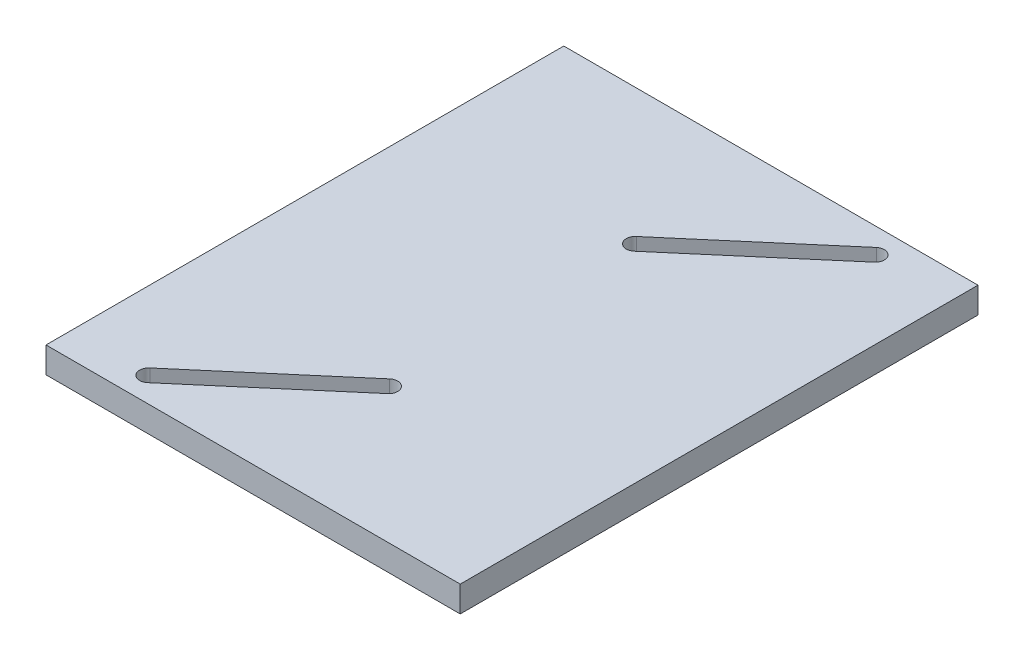
ISO-10303-21;
HEADER;
FILE_DESCRIPTION(('STEP AP214'),'2;1');
FILE_NAME('part.step','',(''),(''),'','','');
FILE_SCHEMA(('AUTOMOTIVE_DESIGN { 1 0 10303 214 1 1 1 1 }'));
ENDSEC;
DATA;
#1=APPLICATION_CONTEXT('core data for automotive mechanical design processes');
#2=APPLICATION_PROTOCOL_DEFINITION('international standard','automotive_design',2000,#1);
#3=PRODUCT_CONTEXT('',#1,'mechanical');
#4=PRODUCT('Part','Part','',(#3));
#5=PRODUCT_RELATED_PRODUCT_CATEGORY('part','',(#4));
#6=PRODUCT_DEFINITION_FORMATION('','',#4);
#7=PRODUCT_DEFINITION_CONTEXT('part definition',#1,'design');
#8=PRODUCT_DEFINITION('design','',#6,#7);
#9=PRODUCT_DEFINITION_SHAPE('','',#8);
#10=(LENGTH_UNIT() NAMED_UNIT(*) SI_UNIT(.MILLI.,.METRE.));
#11=(NAMED_UNIT(*) PLANE_ANGLE_UNIT() SI_UNIT($,.RADIAN.));
#12=(NAMED_UNIT(*) SI_UNIT($,.STERADIAN.) SOLID_ANGLE_UNIT());
#13=UNCERTAINTY_MEASURE_WITH_UNIT(LENGTH_MEASURE(1.E-05),#10,'distance_accuracy_value','');
#14=(GEOMETRIC_REPRESENTATION_CONTEXT(3) GLOBAL_UNCERTAINTY_ASSIGNED_CONTEXT((#13)) GLOBAL_UNIT_ASSIGNED_CONTEXT((#10,
#11,#12)) REPRESENTATION_CONTEXT('',''));
#15=CARTESIAN_POINT('',(0.,0.,0.));
#16=DIRECTION('',(0.,0.,1.));
#17=DIRECTION('',(1.,0.,0.));
#18=AXIS2_PLACEMENT_3D('',#15,#16,#17);
#19=CARTESIAN_POINT('',(50.8,6.35,63.5));
#20=DIRECTION('',(-1.,0.,0.));
#21=DIRECTION('',(0.,0.,1.));
#22=AXIS2_PLACEMENT_3D('',#19,#20,#21);
#23=PLANE('',#22);
#24=DIRECTION('',(0.,0.,-1.));
#25=VECTOR('',#24,1.);
#26=CARTESIAN_POINT('',(50.8,0.,63.5));
#27=LINE('',#26,#25);
#28=CARTESIAN_POINT('',(50.8,0.,63.5));
#29=VERTEX_POINT('',#28);
#30=CARTESIAN_POINT('',(50.8,0.,-63.5));
#31=VERTEX_POINT('',#30);
#32=EDGE_CURVE('E175',#29,#31,#27,.T.);
#33=ORIENTED_EDGE('',*,*,#32,.T.);
#34=DIRECTION('',(0.,-1.,0.));
#35=VECTOR('',#34,1.);
#36=CARTESIAN_POINT('',(50.8,6.35,-63.5));
#37=LINE('',#36,#35);
#38=CARTESIAN_POINT('',(50.8,6.35,-63.5));
#39=VERTEX_POINT('',#38);
#40=EDGE_CURVE('E11',#39,#31,#37,.T.);
#41=ORIENTED_EDGE('',*,*,#40,.F.);
#42=DIRECTION('',(0.,0.,-1.));
#43=VECTOR('',#42,1.);
#44=CARTESIAN_POINT('',(50.8,6.35,63.5));
#45=LINE('',#44,#43);
#46=CARTESIAN_POINT('',(50.8,6.35,63.5));
#47=VERTEX_POINT('',#46);
#48=EDGE_CURVE('E222',#47,#39,#45,.T.);
#49=ORIENTED_EDGE('',*,*,#48,.F.);
#50=DIRECTION('',(0.,-1.,0.));
#51=VECTOR('',#50,1.);
#52=CARTESIAN_POINT('',(50.8,6.35,63.5));
#53=LINE('',#52,#51);
#54=EDGE_CURVE('E236',#47,#29,#53,.T.);
#55=ORIENTED_EDGE('',*,*,#54,.T.);
#56=EDGE_LOOP('',(#33,#41,#49,#55));
#57=FACE_BOUND('',#56,.T.);
#58=ADVANCED_FACE('F39',(#57),#23,.F.);
#59=CARTESIAN_POINT('',(-50.8,6.35,-63.5));
#60=DIRECTION('',(0.,0.,1.));
#61=DIRECTION('',(1.,0.,0.));
#62=AXIS2_PLACEMENT_3D('',#59,#60,#61);
#63=PLANE('',#62);
#64=DIRECTION('',(-1.,0.,0.));
#65=VECTOR('',#64,1.);
#66=CARTESIAN_POINT('',(-50.8,0.,-63.5));
#67=LINE('',#66,#65);
#68=CARTESIAN_POINT('',(-50.8,0.,-63.5));
#69=VERTEX_POINT('',#68);
#70=EDGE_CURVE('E240',#31,#69,#67,.T.);
#71=ORIENTED_EDGE('',*,*,#70,.T.);
#72=DIRECTION('',(0.,-1.,0.));
#73=VECTOR('',#72,1.);
#74=CARTESIAN_POINT('',(-50.8,6.35,-63.5));
#75=LINE('',#74,#73);
#76=CARTESIAN_POINT('',(-50.8,6.35,-63.5));
#77=VERTEX_POINT('',#76);
#78=EDGE_CURVE('E47',#77,#69,#75,.T.);
#79=ORIENTED_EDGE('',*,*,#78,.F.);
#80=DIRECTION('',(-1.,0.,0.));
#81=VECTOR('',#80,1.);
#82=CARTESIAN_POINT('',(-50.8,6.35,-63.5));
#83=LINE('',#82,#81);
#84=EDGE_CURVE('E226',#39,#77,#83,.T.);
#85=ORIENTED_EDGE('',*,*,#84,.F.);
#86=ORIENTED_EDGE('',*,*,#40,.T.);
#87=EDGE_LOOP('',(#71,#79,#85,#86));
#88=FACE_BOUND('',#87,.T.);
#89=ADVANCED_FACE('F275',(#88),#63,.F.);
#90=CARTESIAN_POINT('',(-50.8,6.35,63.5));
#91=DIRECTION('',(1.,0.,0.));
#92=DIRECTION('',(0.,0.,-1.));
#93=AXIS2_PLACEMENT_3D('',#90,#91,#92);
#94=PLANE('',#93);
#95=DIRECTION('',(0.,0.,1.));
#96=VECTOR('',#95,1.);
#97=CARTESIAN_POINT('',(-50.8,0.,63.5));
#98=LINE('',#97,#96);
#99=CARTESIAN_POINT('',(-50.8,0.,63.5));
#100=VERTEX_POINT('',#99);
#101=EDGE_CURVE('E243',#69,#100,#98,.T.);
#102=ORIENTED_EDGE('',*,*,#101,.T.);
#103=DIRECTION('',(0.,-1.,0.));
#104=VECTOR('',#103,1.);
#105=CARTESIAN_POINT('',(-50.8,6.35,63.5));
#106=LINE('',#105,#104);
#107=CARTESIAN_POINT('',(-50.8,6.35,63.5));
#108=VERTEX_POINT('',#107);
#109=EDGE_CURVE('E251',#108,#100,#106,.T.);
#110=ORIENTED_EDGE('',*,*,#109,.F.);
#111=DIRECTION('',(0.,0.,1.));
#112=VECTOR('',#111,1.);
#113=CARTESIAN_POINT('',(-50.8,6.35,63.5));
#114=LINE('',#113,#112);
#115=EDGE_CURVE('E230',#77,#108,#114,.T.);
#116=ORIENTED_EDGE('',*,*,#115,.F.);
#117=ORIENTED_EDGE('',*,*,#78,.T.);
#118=EDGE_LOOP('',(#102,#110,#116,#117));
#119=FACE_BOUND('',#118,.T.);
#120=ADVANCED_FACE('F260',(#119),#94,.F.);
#121=CARTESIAN_POINT('',(-50.8,6.35,63.5));
#122=DIRECTION('',(0.,0.,-1.));
#123=DIRECTION('',(-1.,0.,0.));
#124=AXIS2_PLACEMENT_3D('',#121,#122,#123);
#125=PLANE('',#124);
#126=DIRECTION('',(1.,0.,0.));
#127=VECTOR('',#126,1.);
#128=CARTESIAN_POINT('',(-50.8,0.,63.5));
#129=LINE('',#128,#127);
#130=EDGE_CURVE('E227',#100,#29,#129,.T.);
#131=ORIENTED_EDGE('',*,*,#130,.T.);
#132=ORIENTED_EDGE('',*,*,#54,.F.);
#133=DIRECTION('',(1.,0.,0.));
#134=VECTOR('',#133,1.);
#135=CARTESIAN_POINT('',(-50.8,6.35,63.5));
#136=LINE('',#135,#134);
#137=EDGE_CURVE('E233',#108,#47,#136,.T.);
#138=ORIENTED_EDGE('',*,*,#137,.F.);
#139=ORIENTED_EDGE('',*,*,#109,.T.);
#140=EDGE_LOOP('',(#131,#132,#138,#139));
#141=FACE_BOUND('',#140,.T.);
#142=ADVANCED_FACE('F268',(#141),#125,.F.);
#143=CARTESIAN_POINT('',(0.,6.35,0.));
#144=DIRECTION('',(0.,-1.,0.));
#145=DIRECTION('',(0.,0.,-1.));
#146=AXIS2_PLACEMENT_3D('',#143,#144,#145);
#147=PLANE('',#146);
#148=DIRECTION('',(0.760646581040125,0.,-0.649166218122884));
#149=VECTOR('',#148,1.);
#150=CARTESIAN_POINT('',(1.44277191977811,6.35,-28.5583229736383));
#151=LINE('',#150,#149);
#152=CARTESIAN_POINT('',(1.44277191977811,6.35,-28.5583229736383));
#153=VERTEX_POINT('',#152);
#154=CARTESIAN_POINT('',(33.1927719197781,6.35,-55.6550429736383));
#155=VERTEX_POINT('',#154);
#156=EDGE_CURVE('E165',#153,#155,#151,.T.);
#157=ORIENTED_EDGE('',*,*,#156,.F.);
#158=CARTESIAN_POINT('',(0.,6.35,-30.24886));
#159=DIRECTION('',(0.,1.,0.));
#160=DIRECTION('',(0.,0.,1.));
#161=AXIS2_PLACEMENT_3D('',#158,#159,#160);
#162=CIRCLE('',#161,2.2225);
#163=CARTESIAN_POINT('',(-1.44277191977811,6.35,-31.9393970263617));
#164=VERTEX_POINT('',#163);
#165=EDGE_CURVE('E54',#164,#153,#162,.T.);
#166=ORIENTED_EDGE('',*,*,#165,.F.);
#167=DIRECTION('',(-0.760646581040125,0.,0.649166218122884));
#168=VECTOR('',#167,1.);
#169=CARTESIAN_POINT('',(-1.44277191977811,6.35,-31.9393970263617));
#170=LINE('',#169,#168);
#171=CARTESIAN_POINT('',(30.3072280802219,6.35,-59.0361170263617));
#172=VERTEX_POINT('',#171);
#173=EDGE_CURVE('E152',#172,#164,#170,.T.);
#174=ORIENTED_EDGE('',*,*,#173,.F.);
#175=CARTESIAN_POINT('',(31.75,6.35,-57.34558));
#176=DIRECTION('',(0.,1.,0.));
#177=DIRECTION('',(0.,0.,1.));
#178=AXIS2_PLACEMENT_3D('',#175,#176,#177);
#179=CIRCLE('',#178,2.22250000000001);
#180=EDGE_CURVE('E156',#155,#172,#179,.T.);
#181=ORIENTED_EDGE('',*,*,#180,.F.);
#182=EDGE_LOOP('',(#157,#166,#174,#181));
#183=FACE_BOUND('',#182,.T.);
#184=DIRECTION('',(-0.760646581040125,0.,0.649166218122884));
#185=VECTOR('',#184,1.);
#186=CARTESIAN_POINT('',(-1.44277191977809,6.35,28.5583229736383));
#187=LINE('',#186,#185);
#188=CARTESIAN_POINT('',(-1.44277191977808,6.35,28.5583229736383));
#189=VERTEX_POINT('',#188);
#190=CARTESIAN_POINT('',(-33.1927719197781,6.35,55.6550429736383));
#191=VERTEX_POINT('',#190);
#192=EDGE_CURVE('E201',#189,#191,#187,.T.);
#193=ORIENTED_EDGE('',*,*,#192,.F.);
#194=CARTESIAN_POINT('',(0.,6.35,30.24886));
#195=DIRECTION('',(0.,1.,0.));
#196=DIRECTION('',(0.,0.,1.));
#197=AXIS2_PLACEMENT_3D('',#194,#195,#196);
#198=CIRCLE('',#197,2.2225);
#199=CARTESIAN_POINT('',(1.44277191977814,6.35,31.9393970263617));
#200=VERTEX_POINT('',#199);
#201=EDGE_CURVE('E62',#200,#189,#198,.T.);
#202=ORIENTED_EDGE('',*,*,#201,.F.);
#203=DIRECTION('',(0.760646581040125,0.,-0.649166218122884));
#204=VECTOR('',#203,1.);
#205=CARTESIAN_POINT('',(1.44277191977814,6.35,31.9393970263617));
#206=LINE('',#205,#204);
#207=CARTESIAN_POINT('',(-30.3072280802219,6.35,59.0361170263617));
#208=VERTEX_POINT('',#207);
#209=EDGE_CURVE('E186',#208,#200,#206,.T.);
#210=ORIENTED_EDGE('',*,*,#209,.F.);
#211=CARTESIAN_POINT('',(-31.75,6.35,57.34558));
#212=DIRECTION('',(0.,1.,0.));
#213=DIRECTION('',(0.,0.,1.));
#214=AXIS2_PLACEMENT_3D('',#211,#212,#213);
#215=CIRCLE('',#214,2.22250000000001);
#216=EDGE_CURVE('E205',#191,#208,#215,.T.);
#217=ORIENTED_EDGE('',*,*,#216,.F.);
#218=EDGE_LOOP('',(#193,#202,#210,#217));
#219=FACE_BOUND('',#218,.T.);
#220=ORIENTED_EDGE('',*,*,#48,.T.);
#221=ORIENTED_EDGE('',*,*,#84,.T.);
#222=ORIENTED_EDGE('',*,*,#115,.T.);
#223=ORIENTED_EDGE('',*,*,#137,.T.);
#224=EDGE_LOOP('',(#220,#221,#222,#223));
#225=FACE_BOUND('',#224,.T.);
#226=ADVANCED_FACE('F274',(#183,#219,#225),#147,.F.);
#227=CARTESIAN_POINT('',(0.,0.,0.));
#228=DIRECTION('',(0.,-1.,0.));
#229=DIRECTION('',(0.,0.,-1.));
#230=AXIS2_PLACEMENT_3D('',#227,#228,#229);
#231=PLANE('',#230);
#232=CARTESIAN_POINT('',(0.,0.,-30.24886));
#233=DIRECTION('',(0.,1.,0.));
#234=DIRECTION('',(0.,0.,1.));
#235=AXIS2_PLACEMENT_3D('',#232,#233,#234);
#236=CIRCLE('',#235,2.2225);
#237=CARTESIAN_POINT('',(-1.44277191977811,0.,-31.9393970263617));
#238=VERTEX_POINT('',#237);
#239=CARTESIAN_POINT('',(1.44277191977811,0.,-28.5583229736383));
#240=VERTEX_POINT('',#239);
#241=EDGE_CURVE('E130',#238,#240,#236,.T.);
#242=ORIENTED_EDGE('',*,*,#241,.T.);
#243=DIRECTION('',(0.760646581040125,0.,-0.649166218122884));
#244=VECTOR('',#243,1.);
#245=CARTESIAN_POINT('',(1.44277191977811,0.,-28.5583229736383));
#246=LINE('',#245,#244);
#247=CARTESIAN_POINT('',(33.1927719197781,0.,-55.6550429736383));
#248=VERTEX_POINT('',#247);
#249=EDGE_CURVE('E141',#240,#248,#246,.T.);
#250=ORIENTED_EDGE('',*,*,#249,.T.);
#251=CARTESIAN_POINT('',(31.75,0.,-57.34558));
#252=DIRECTION('',(0.,1.,0.));
#253=DIRECTION('',(0.,0.,1.));
#254=AXIS2_PLACEMENT_3D('',#251,#252,#253);
#255=CIRCLE('',#254,2.22250000000001);
#256=CARTESIAN_POINT('',(30.3072280802219,0.,-59.0361170263617));
#257=VERTEX_POINT('',#256);
#258=EDGE_CURVE('E146',#248,#257,#255,.T.);
#259=ORIENTED_EDGE('',*,*,#258,.T.);
#260=DIRECTION('',(-0.760646581040125,0.,0.649166218122884));
#261=VECTOR('',#260,1.);
#262=CARTESIAN_POINT('',(-1.44277191977811,0.,-31.9393970263617));
#263=LINE('',#262,#261);
#264=EDGE_CURVE('E137',#257,#238,#263,.T.);
#265=ORIENTED_EDGE('',*,*,#264,.T.);
#266=EDGE_LOOP('',(#242,#250,#259,#265));
#267=FACE_BOUND('',#266,.T.);
#268=CARTESIAN_POINT('',(0.,0.,30.24886));
#269=DIRECTION('',(0.,1.,0.));
#270=DIRECTION('',(0.,0.,1.));
#271=AXIS2_PLACEMENT_3D('',#268,#269,#270);
#272=CIRCLE('',#271,2.2225);
#273=CARTESIAN_POINT('',(1.44277191977814,0.,31.9393970263617));
#274=VERTEX_POINT('',#273);
#275=CARTESIAN_POINT('',(-1.44277191977809,0.,28.5583229736383));
#276=VERTEX_POINT('',#275);
#277=EDGE_CURVE('E181',#274,#276,#272,.T.);
#278=ORIENTED_EDGE('',*,*,#277,.T.);
#279=DIRECTION('',(-0.760646581040125,0.,0.649166218122884));
#280=VECTOR('',#279,1.);
#281=CARTESIAN_POINT('',(-1.44277191977809,0.,28.5583229736383));
#282=LINE('',#281,#280);
#283=CARTESIAN_POINT('',(-33.1927719197781,0.,55.6550429736383));
#284=VERTEX_POINT('',#283);
#285=EDGE_CURVE('E185',#276,#284,#282,.T.);
#286=ORIENTED_EDGE('',*,*,#285,.T.);
#287=CARTESIAN_POINT('',(-31.75,0.,57.34558));
#288=DIRECTION('',(0.,1.,0.));
#289=DIRECTION('',(0.,0.,1.));
#290=AXIS2_PLACEMENT_3D('',#287,#288,#289);
#291=CIRCLE('',#290,2.22250000000001);
#292=CARTESIAN_POINT('',(-30.3072280802219,0.,59.0361170263617));
#293=VERTEX_POINT('',#292);
#294=EDGE_CURVE('E190',#284,#293,#291,.T.);
#295=ORIENTED_EDGE('',*,*,#294,.T.);
#296=DIRECTION('',(0.760646581040125,0.,-0.649166218122884));
#297=VECTOR('',#296,1.);
#298=CARTESIAN_POINT('',(1.44277191977814,0.,31.9393970263617));
#299=LINE('',#298,#297);
#300=EDGE_CURVE('E194',#293,#274,#299,.T.);
#301=ORIENTED_EDGE('',*,*,#300,.T.);
#302=EDGE_LOOP('',(#278,#286,#295,#301));
#303=FACE_BOUND('',#302,.T.);
#304=ORIENTED_EDGE('',*,*,#32,.F.);
#305=ORIENTED_EDGE('',*,*,#130,.F.);
#306=ORIENTED_EDGE('',*,*,#101,.F.);
#307=ORIENTED_EDGE('',*,*,#70,.F.);
#308=EDGE_LOOP('',(#304,#305,#306,#307));
#309=FACE_BOUND('',#308,.T.);
#310=ADVANCED_FACE('F148',(#267,#303,#309),#231,.T.);
#311=CARTESIAN_POINT('',(0.,0.,30.24886));
#312=DIRECTION('',(0.,1.,0.));
#313=DIRECTION('',(0.,0.,1.));
#314=AXIS2_PLACEMENT_3D('',#311,#312,#313);
#315=CYLINDRICAL_SURFACE('',#314,2.2225);
#316=ORIENTED_EDGE('',*,*,#201,.T.);
#317=DIRECTION('',(0.,1.,0.));
#318=VECTOR('',#317,1.);
#319=CARTESIAN_POINT('',(-1.44277191977809,0.,28.5583229736383));
#320=LINE('',#319,#318);
#321=EDGE_CURVE('E198',#276,#189,#320,.T.);
#322=ORIENTED_EDGE('',*,*,#321,.F.);
#323=ORIENTED_EDGE('',*,*,#277,.F.);
#324=DIRECTION('',(0.,1.,0.));
#325=VECTOR('',#324,1.);
#326=CARTESIAN_POINT('',(1.44277191977814,0.,31.9393970263617));
#327=LINE('',#326,#325);
#328=EDGE_CURVE('E166',#274,#200,#327,.T.);
#329=ORIENTED_EDGE('',*,*,#328,.T.);
#330=EDGE_LOOP('',(#316,#322,#323,#329));
#331=FACE_BOUND('',#330,.T.);
#332=ADVANCED_FACE('F287',(#331),#315,.F.);
#333=CARTESIAN_POINT('',(1.44277191977814,0.,31.9393970263617));
#334=DIRECTION('',(0.649166218122884,0.,0.760646581040125));
#335=DIRECTION('',(0.760646581040125,0.,-0.649166218122884));
#336=AXIS2_PLACEMENT_3D('',#333,#334,#335);
#337=PLANE('',#336);
#338=ORIENTED_EDGE('',*,*,#209,.T.);
#339=ORIENTED_EDGE('',*,*,#328,.F.);
#340=ORIENTED_EDGE('',*,*,#300,.F.);
#341=DIRECTION('',(0.,1.,0.));
#342=VECTOR('',#341,1.);
#343=CARTESIAN_POINT('',(-30.3072280802219,0.,59.0361170263617));
#344=LINE('',#343,#342);
#345=EDGE_CURVE('E214',#293,#208,#344,.T.);
#346=ORIENTED_EDGE('',*,*,#345,.T.);
#347=EDGE_LOOP('',(#338,#339,#340,#346));
#348=FACE_BOUND('',#347,.T.);
#349=ADVANCED_FACE('F293',(#348),#337,.F.);
#350=CARTESIAN_POINT('',(-31.75,0.,57.34558));
#351=DIRECTION('',(0.,1.,0.));
#352=DIRECTION('',(0.,0.,1.));
#353=AXIS2_PLACEMENT_3D('',#350,#351,#352);
#354=CYLINDRICAL_SURFACE('',#353,2.22250000000001);
#355=ORIENTED_EDGE('',*,*,#216,.T.);
#356=ORIENTED_EDGE('',*,*,#345,.F.);
#357=ORIENTED_EDGE('',*,*,#294,.F.);
#358=DIRECTION('',(0.,1.,0.));
#359=VECTOR('',#358,1.);
#360=CARTESIAN_POINT('',(-33.1927719197781,0.,55.6550429736383));
#361=LINE('',#360,#359);
#362=EDGE_CURVE('E217',#284,#191,#361,.T.);
#363=ORIENTED_EDGE('',*,*,#362,.T.);
#364=EDGE_LOOP('',(#355,#356,#357,#363));
#365=FACE_BOUND('',#364,.T.);
#366=ADVANCED_FACE('F297',(#365),#354,.F.);
#367=CARTESIAN_POINT('',(-1.44277191977809,0.,28.5583229736383));
#368=DIRECTION('',(-0.649166218122884,0.,-0.760646581040125));
#369=DIRECTION('',(-0.760646581040125,0.,0.649166218122884));
#370=AXIS2_PLACEMENT_3D('',#367,#368,#369);
#371=PLANE('',#370);
#372=ORIENTED_EDGE('',*,*,#192,.T.);
#373=ORIENTED_EDGE('',*,*,#362,.F.);
#374=ORIENTED_EDGE('',*,*,#285,.F.);
#375=ORIENTED_EDGE('',*,*,#321,.T.);
#376=EDGE_LOOP('',(#372,#373,#374,#375));
#377=FACE_BOUND('',#376,.T.);
#378=ADVANCED_FACE('F294',(#377),#371,.F.);
#379=CARTESIAN_POINT('',(0.,0.,-30.24886));
#380=DIRECTION('',(0.,1.,0.));
#381=DIRECTION('',(0.,0.,1.));
#382=AXIS2_PLACEMENT_3D('',#379,#380,#381);
#383=CYLINDRICAL_SURFACE('',#382,2.2225);
#384=ORIENTED_EDGE('',*,*,#165,.T.);
#385=DIRECTION('',(0.,1.,0.));
#386=VECTOR('',#385,1.);
#387=CARTESIAN_POINT('',(1.44277191977811,0.,-28.5583229736383));
#388=LINE('',#387,#386);
#389=EDGE_CURVE('E126',#240,#153,#388,.T.);
#390=ORIENTED_EDGE('',*,*,#389,.F.);
#391=ORIENTED_EDGE('',*,*,#241,.F.);
#392=DIRECTION('',(0.,1.,0.));
#393=VECTOR('',#392,1.);
#394=CARTESIAN_POINT('',(-1.44277191977811,0.,-31.9393970263617));
#395=LINE('',#394,#393);
#396=EDGE_CURVE('E172',#238,#164,#395,.T.);
#397=ORIENTED_EDGE('',*,*,#396,.T.);
#398=EDGE_LOOP('',(#384,#390,#391,#397));
#399=FACE_BOUND('',#398,.T.);
#400=ADVANCED_FACE('F128',(#399),#383,.F.);
#401=CARTESIAN_POINT('',(-1.44277191977811,0.,-31.9393970263617));
#402=DIRECTION('',(-0.649166218122884,0.,-0.760646581040125));
#403=DIRECTION('',(-0.760646581040125,0.,0.649166218122884));
#404=AXIS2_PLACEMENT_3D('',#401,#402,#403);
#405=PLANE('',#404);
#406=ORIENTED_EDGE('',*,*,#173,.T.);
#407=ORIENTED_EDGE('',*,*,#396,.F.);
#408=ORIENTED_EDGE('',*,*,#264,.F.);
#409=DIRECTION('',(0.,1.,0.));
#410=VECTOR('',#409,1.);
#411=CARTESIAN_POINT('',(30.3072280802219,0.,-59.0361170263617));
#412=LINE('',#411,#410);
#413=EDGE_CURVE('E176',#257,#172,#412,.T.);
#414=ORIENTED_EDGE('',*,*,#413,.T.);
#415=EDGE_LOOP('',(#406,#407,#408,#414));
#416=FACE_BOUND('',#415,.T.);
#417=ADVANCED_FACE('F307',(#416),#405,.F.);
#418=CARTESIAN_POINT('',(31.75,0.,-57.34558));
#419=DIRECTION('',(0.,1.,0.));
#420=DIRECTION('',(0.,0.,1.));
#421=AXIS2_PLACEMENT_3D('',#418,#419,#420);
#422=CYLINDRICAL_SURFACE('',#421,2.22250000000001);
#423=ORIENTED_EDGE('',*,*,#180,.T.);
#424=ORIENTED_EDGE('',*,*,#413,.F.);
#425=ORIENTED_EDGE('',*,*,#258,.F.);
#426=DIRECTION('',(0.,1.,0.));
#427=VECTOR('',#426,1.);
#428=CARTESIAN_POINT('',(33.1927719197781,0.,-55.6550429736383));
#429=LINE('',#428,#427);
#430=EDGE_CURVE('E136',#248,#155,#429,.T.);
#431=ORIENTED_EDGE('',*,*,#430,.T.);
#432=EDGE_LOOP('',(#423,#424,#425,#431));
#433=FACE_BOUND('',#432,.T.);
#434=ADVANCED_FACE('F310',(#433),#422,.F.);
#435=CARTESIAN_POINT('',(1.44277191977811,0.,-28.5583229736383));
#436=DIRECTION('',(0.649166218122884,0.,0.760646581040125));
#437=DIRECTION('',(0.760646581040125,0.,-0.649166218122884));
#438=AXIS2_PLACEMENT_3D('',#435,#436,#437);
#439=PLANE('',#438);
#440=ORIENTED_EDGE('',*,*,#156,.T.);
#441=ORIENTED_EDGE('',*,*,#430,.F.);
#442=ORIENTED_EDGE('',*,*,#249,.F.);
#443=ORIENTED_EDGE('',*,*,#389,.T.);
#444=EDGE_LOOP('',(#440,#441,#442,#443));
#445=FACE_BOUND('',#444,.T.);
#446=ADVANCED_FACE('F142',(#445),#439,.F.);
#447=CLOSED_SHELL('',(#58,#89,#120,#142,#226,#310,#332,#349,#366,#378,#400,#417,#434,#446));
#448=MANIFOLD_SOLID_BREP('B2',#447);
#449=ADVANCED_BREP_SHAPE_REPRESENTATION('',(#18,#448),#14);
#450=SHAPE_DEFINITION_REPRESENTATION(#9,#449);
ENDSEC;
END-ISO-10303-21;
